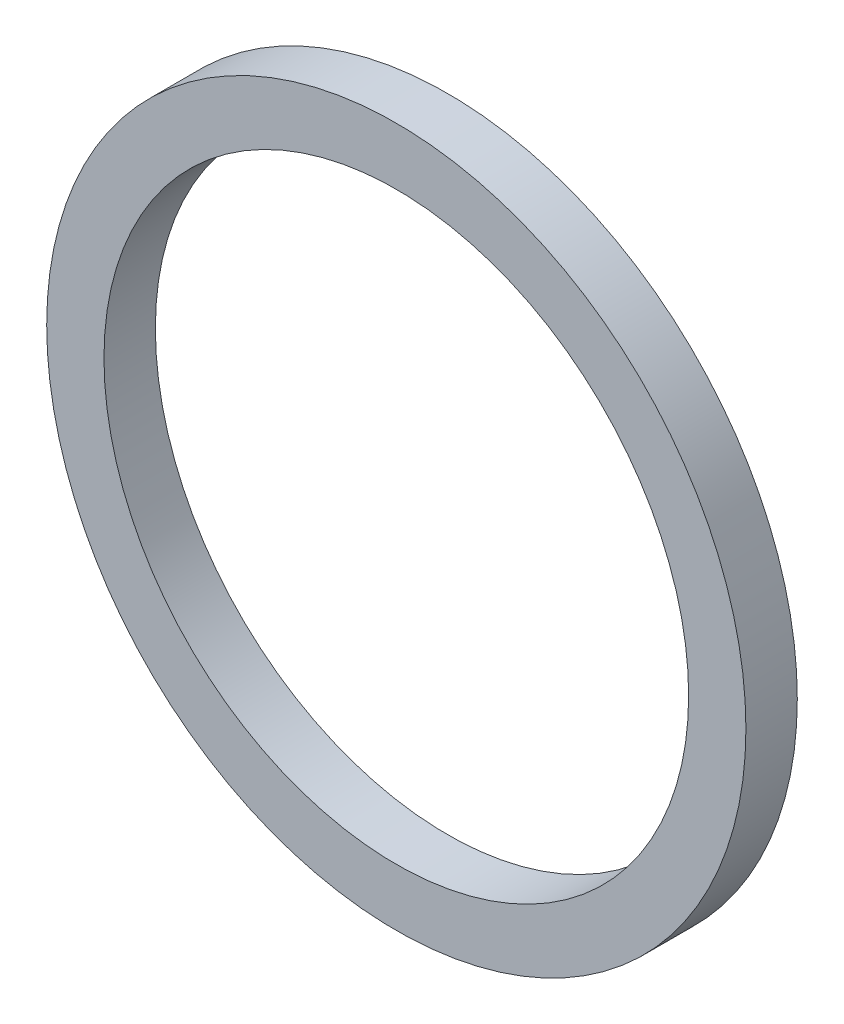
ISO-10303-21;
HEADER;
FILE_DESCRIPTION(('STEP AP214'),'2;1');
FILE_NAME('part.step','',(''),(''),'','','');
FILE_SCHEMA(('AUTOMOTIVE_DESIGN { 1 0 10303 214 1 1 1 1 }'));
ENDSEC;
DATA;
#1=APPLICATION_CONTEXT('core data for automotive mechanical design processes');
#2=APPLICATION_PROTOCOL_DEFINITION('international standard','automotive_design',2000,#1);
#3=PRODUCT_CONTEXT('',#1,'mechanical');
#4=PRODUCT('Part','Part','',(#3));
#5=PRODUCT_RELATED_PRODUCT_CATEGORY('part','',(#4));
#6=PRODUCT_DEFINITION_FORMATION('','',#4);
#7=PRODUCT_DEFINITION_CONTEXT('part definition',#1,'design');
#8=PRODUCT_DEFINITION('design','',#6,#7);
#9=PRODUCT_DEFINITION_SHAPE('','',#8);
#10=(LENGTH_UNIT() NAMED_UNIT(*) SI_UNIT(.MILLI.,.METRE.));
#11=(NAMED_UNIT(*) PLANE_ANGLE_UNIT() SI_UNIT($,.RADIAN.));
#12=(NAMED_UNIT(*) SI_UNIT($,.STERADIAN.) SOLID_ANGLE_UNIT());
#13=UNCERTAINTY_MEASURE_WITH_UNIT(LENGTH_MEASURE(1.E-05),#10,'distance_accuracy_value','');
#14=(GEOMETRIC_REPRESENTATION_CONTEXT(3) GLOBAL_UNCERTAINTY_ASSIGNED_CONTEXT((#13)) GLOBAL_UNIT_ASSIGNED_CONTEXT((#10,
#11,#12)) REPRESENTATION_CONTEXT('',''));
#15=CARTESIAN_POINT('',(0.,0.,0.));
#16=DIRECTION('',(0.,0.,1.));
#17=DIRECTION('',(1.,0.,0.));
#18=AXIS2_PLACEMENT_3D('',#15,#16,#17);
#19=CARTESIAN_POINT('',(-19.8294622366385,16.2634263857424,23.0610727684494));
#20=DIRECTION('',(0.,0.,1.));
#21=DIRECTION('',(1.,0.,0.));
#22=AXIS2_PLACEMENT_3D('',#19,#20,#21);
#23=PLANE('',#22);
#24=CARTESIAN_POINT('',(-15.0851879776712,21.0077006447096,23.0610727684494));
#25=DIRECTION('',(0.,0.,1.));
#26=DIRECTION('',(1.,0.,0.));
#27=AXIS2_PLACEMENT_3D('',#24,#25,#26);
#28=CIRCLE('',#27,2.8445501529186);
#29=CARTESIAN_POINT('',(-12.2406378247526,21.0077006447096,23.0610727684494));
#30=VERTEX_POINT('',#29);
#31=EDGE_CURVE('E27',#30,#30,#28,.T.);
#32=ORIENTED_EDGE('',*,*,#31,.F.);
#33=EDGE_LOOP('',(#32));
#34=FACE_BOUND('',#33,.T.);
#35=CARTESIAN_POINT('',(-15.0851879776712,21.0077006447096,23.0610727684494));
#36=DIRECTION('',(0.,0.,1.));
#37=DIRECTION('',(1.,0.,0.));
#38=AXIS2_PLACEMENT_3D('',#35,#36,#37);
#39=CIRCLE('',#38,3.40183838353577);
#40=CARTESIAN_POINT('',(-11.6833495941355,21.0077006447096,23.0610727684494));
#41=VERTEX_POINT('',#40);
#42=EDGE_CURVE('E18',#41,#41,#39,.F.);
#43=ORIENTED_EDGE('',*,*,#42,.F.);
#44=EDGE_LOOP('',(#43));
#45=FACE_BOUND('',#44,.T.);
#46=ADVANCED_FACE('F14',(#34,#45),#23,.T.);
#47=CARTESIAN_POINT('',(-15.0851879776712,21.0077006447096,22.5610727684494));
#48=DIRECTION('',(0.,0.,1.));
#49=DIRECTION('',(1.,0.,0.));
#50=AXIS2_PLACEMENT_3D('',#47,#48,#49);
#51=CYLINDRICAL_SURFACE('',#50,3.40183838353577);
#52=ORIENTED_EDGE('',*,*,#42,.T.);
#53=EDGE_LOOP('',(#52));
#54=FACE_BOUND('',#53,.T.);
#55=CARTESIAN_POINT('',(-15.0851879776713,21.0077006447095,22.5610727684494));
#56=DIRECTION('',(0.,0.,1.));
#57=DIRECTION('',(1.,0.,0.));
#58=AXIS2_PLACEMENT_3D('',#55,#56,#57);
#59=CIRCLE('',#58,3.40183838353576);
#60=CARTESIAN_POINT('',(-11.6833495941355,21.0077006447095,22.5610727684494));
#61=VERTEX_POINT('',#60);
#62=EDGE_CURVE('E22',#61,#61,#59,.F.);
#63=ORIENTED_EDGE('',*,*,#62,.F.);
#64=EDGE_LOOP('',(#63));
#65=FACE_BOUND('',#64,.T.);
#66=ADVANCED_FACE('F35',(#54,#65),#51,.T.);
#67=CARTESIAN_POINT('',(-15.0851879776712,21.0077006447096,22.5610727684494));
#68=DIRECTION('',(0.,0.,1.));
#69=DIRECTION('',(1.,0.,0.));
#70=AXIS2_PLACEMENT_3D('',#67,#68,#69);
#71=CYLINDRICAL_SURFACE('',#70,2.8445501529186);
#72=ORIENTED_EDGE('',*,*,#31,.T.);
#73=EDGE_LOOP('',(#72));
#74=FACE_BOUND('',#73,.T.);
#75=CARTESIAN_POINT('',(-15.0851879776713,21.0077006447096,22.5610727684494));
#76=DIRECTION('',(0.,0.,1.));
#77=DIRECTION('',(1.,0.,0.));
#78=AXIS2_PLACEMENT_3D('',#75,#76,#77);
#79=CIRCLE('',#78,2.8445501529187);
#80=CARTESIAN_POINT('',(-12.2406378247526,21.0077006447096,22.5610727684494));
#81=VERTEX_POINT('',#80);
#82=EDGE_CURVE('E9',#81,#81,#79,.T.);
#83=ORIENTED_EDGE('',*,*,#82,.F.);
#84=EDGE_LOOP('',(#83));
#85=FACE_BOUND('',#84,.T.);
#86=ADVANCED_FACE('F16',(#74,#85),#71,.F.);
#87=CARTESIAN_POINT('',(-19.8294622366385,16.2634263857424,22.5610727684494));
#88=DIRECTION('',(0.,0.,-1.));
#89=DIRECTION('',(-1.,0.,0.));
#90=AXIS2_PLACEMENT_3D('',#87,#88,#89);
#91=PLANE('',#90);
#92=ORIENTED_EDGE('',*,*,#82,.T.);
#93=EDGE_LOOP('',(#92));
#94=FACE_BOUND('',#93,.T.);
#95=ORIENTED_EDGE('',*,*,#62,.T.);
#96=EDGE_LOOP('',(#95));
#97=FACE_BOUND('',#96,.T.);
#98=ADVANCED_FACE('F46',(#94,#97),#91,.T.);
#99=CLOSED_SHELL('',(#46,#66,#86,#98));
#100=MANIFOLD_SOLID_BREP('B1',#99);
#101=ADVANCED_BREP_SHAPE_REPRESENTATION('',(#18,#100),#14);
#102=SHAPE_DEFINITION_REPRESENTATION(#9,#101);
ENDSEC;
END-ISO-10303-21;
